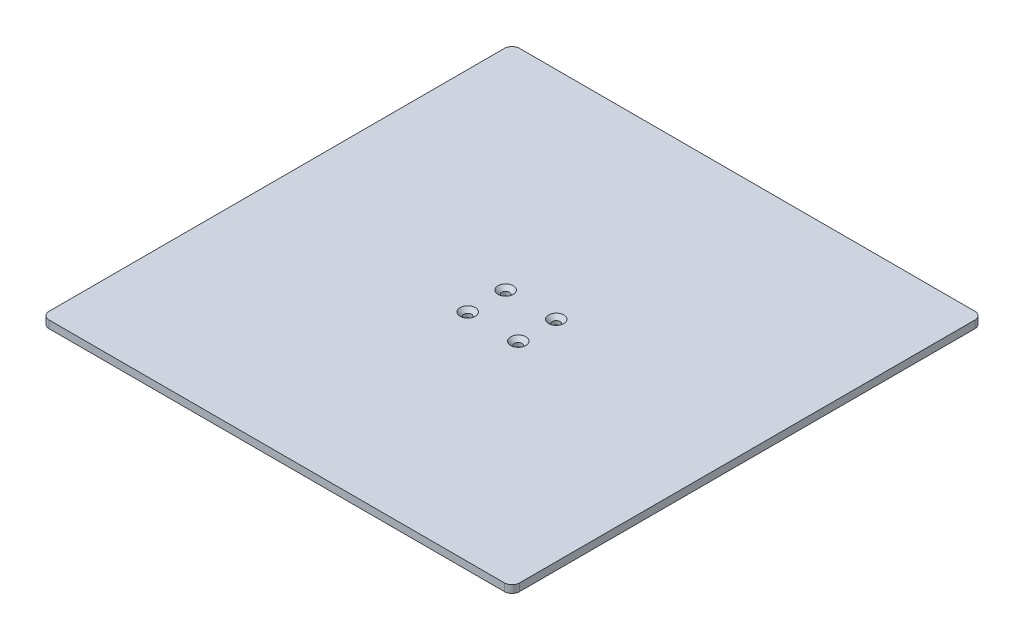
ISO-10303-21;
HEADER;
FILE_DESCRIPTION(('STEP AP214'),'2;1');
FILE_NAME('part.step','',(''),(''),'','','');
FILE_SCHEMA(('AUTOMOTIVE_DESIGN { 1 0 10303 214 1 1 1 1 }'));
ENDSEC;
DATA;
#1=APPLICATION_CONTEXT('core data for automotive mechanical design processes');
#2=APPLICATION_PROTOCOL_DEFINITION('international standard','automotive_design',2000,#1);
#3=PRODUCT_CONTEXT('',#1,'mechanical');
#4=PRODUCT('Part','Part','',(#3));
#5=PRODUCT_RELATED_PRODUCT_CATEGORY('part','',(#4));
#6=PRODUCT_DEFINITION_FORMATION('','',#4);
#7=PRODUCT_DEFINITION_CONTEXT('part definition',#1,'design');
#8=PRODUCT_DEFINITION('design','',#6,#7);
#9=PRODUCT_DEFINITION_SHAPE('','',#8);
#10=(LENGTH_UNIT() NAMED_UNIT(*) SI_UNIT(.MILLI.,.METRE.));
#11=(NAMED_UNIT(*) PLANE_ANGLE_UNIT() SI_UNIT($,.RADIAN.));
#12=(NAMED_UNIT(*) SI_UNIT($,.STERADIAN.) SOLID_ANGLE_UNIT());
#13=UNCERTAINTY_MEASURE_WITH_UNIT(LENGTH_MEASURE(1.E-05),#10,'distance_accuracy_value','');
#14=(GEOMETRIC_REPRESENTATION_CONTEXT(3) GLOBAL_UNCERTAINTY_ASSIGNED_CONTEXT((#13)) GLOBAL_UNIT_ASSIGNED_CONTEXT((#10,
#11,#12)) REPRESENTATION_CONTEXT('',''));
#15=CARTESIAN_POINT('',(0.,0.,0.));
#16=DIRECTION('',(0.,0.,1.));
#17=DIRECTION('',(1.,0.,0.));
#18=AXIS2_PLACEMENT_3D('',#15,#16,#17);
#19=CARTESIAN_POINT('',(93.0000000000001,-3.,93.));
#20=DIRECTION('',(1.,0.,0.));
#21=DIRECTION('',(0.,0.,-1.));
#22=AXIS2_PLACEMENT_3D('',#19,#20,#21);
#23=PLANE('',#22);
#24=DIRECTION('',(0.,0.,-1.));
#25=VECTOR('',#24,1.);
#26=CARTESIAN_POINT('',(93.0000000000001,-3.,93.));
#27=LINE('',#26,#25);
#28=CARTESIAN_POINT('',(93.0000000000001,-3.,90.));
#29=VERTEX_POINT('',#28);
#30=CARTESIAN_POINT('',(93.0000000000001,-3.,-90.));
#31=VERTEX_POINT('',#30);
#32=EDGE_CURVE('E249',#29,#31,#27,.T.);
#33=ORIENTED_EDGE('',*,*,#32,.T.);
#34=DIRECTION('',(0.,1.,0.));
#35=VECTOR('',#34,1.);
#36=CARTESIAN_POINT('',(93.0000000000001,-3.,-90.));
#37=LINE('',#36,#35);
#38=CARTESIAN_POINT('',(93.0000000000001,0.,-90.));
#39=VERTEX_POINT('',#38);
#40=EDGE_CURVE('E150',#31,#39,#37,.T.);
#41=ORIENTED_EDGE('',*,*,#40,.T.);
#42=DIRECTION('',(0.,0.,-1.));
#43=VECTOR('',#42,1.);
#44=CARTESIAN_POINT('',(93.0000000000001,0.,93.));
#45=LINE('',#44,#43);
#46=CARTESIAN_POINT('',(93.0000000000001,0.,90.));
#47=VERTEX_POINT('',#46);
#48=EDGE_CURVE('E248',#47,#39,#45,.T.);
#49=ORIENTED_EDGE('',*,*,#48,.F.);
#50=DIRECTION('',(0.,1.,0.));
#51=VECTOR('',#50,1.);
#52=CARTESIAN_POINT('',(93.0000000000001,-3.,90.));
#53=LINE('',#52,#51);
#54=EDGE_CURVE('E148',#47,#29,#53,.F.);
#55=ORIENTED_EDGE('',*,*,#54,.T.);
#56=EDGE_LOOP('',(#33,#41,#49,#55));
#57=FACE_BOUND('',#56,.T.);
#58=ADVANCED_FACE('F32',(#57),#23,.T.);
#59=CARTESIAN_POINT('',(-93.,-3.,93.));
#60=DIRECTION('',(0.,0.,1.));
#61=DIRECTION('',(1.,0.,0.));
#62=AXIS2_PLACEMENT_3D('',#59,#60,#61);
#63=PLANE('',#62);
#64=DIRECTION('',(1.,0.,0.));
#65=VECTOR('',#64,1.);
#66=CARTESIAN_POINT('',(-93.,0.,93.));
#67=LINE('',#66,#65);
#68=CARTESIAN_POINT('',(-90.,0.,93.));
#69=VERTEX_POINT('',#68);
#70=CARTESIAN_POINT('',(90.0000000000001,0.,93.));
#71=VERTEX_POINT('',#70);
#72=EDGE_CURVE('E118',#69,#71,#67,.T.);
#73=ORIENTED_EDGE('',*,*,#72,.F.);
#74=DIRECTION('',(0.,1.,0.));
#75=VECTOR('',#74,1.);
#76=CARTESIAN_POINT('',(-90.,-3.,93.));
#77=LINE('',#76,#75);
#78=CARTESIAN_POINT('',(-90.,-3.,93.));
#79=VERTEX_POINT('',#78);
#80=EDGE_CURVE('E136',#69,#79,#77,.F.);
#81=ORIENTED_EDGE('',*,*,#80,.T.);
#82=DIRECTION('',(1.,0.,0.));
#83=VECTOR('',#82,1.);
#84=CARTESIAN_POINT('',(-93.,-3.,93.));
#85=LINE('',#84,#83);
#86=CARTESIAN_POINT('',(90.0000000000001,-3.,93.));
#87=VERTEX_POINT('',#86);
#88=EDGE_CURVE('E121',#79,#87,#85,.T.);
#89=ORIENTED_EDGE('',*,*,#88,.T.);
#90=DIRECTION('',(0.,1.,0.));
#91=VECTOR('',#90,1.);
#92=CARTESIAN_POINT('',(90.0000000000001,-3.,93.));
#93=LINE('',#92,#91);
#94=EDGE_CURVE('E133',#87,#71,#93,.T.);
#95=ORIENTED_EDGE('',*,*,#94,.T.);
#96=EDGE_LOOP('',(#73,#81,#89,#95));
#97=FACE_BOUND('',#96,.T.);
#98=ADVANCED_FACE('F190',(#97),#63,.T.);
#99=CARTESIAN_POINT('',(-93.,-3.,93.));
#100=DIRECTION('',(-1.,0.,0.));
#101=DIRECTION('',(0.,0.,1.));
#102=AXIS2_PLACEMENT_3D('',#99,#100,#101);
#103=PLANE('',#102);
#104=DIRECTION('',(0.,0.,1.));
#105=VECTOR('',#104,1.);
#106=CARTESIAN_POINT('',(-93.,-3.,93.));
#107=LINE('',#106,#105);
#108=CARTESIAN_POINT('',(-93.,-3.,-90.));
#109=VERTEX_POINT('',#108);
#110=CARTESIAN_POINT('',(-93.,-3.,90.));
#111=VERTEX_POINT('',#110);
#112=EDGE_CURVE('E126',#109,#111,#107,.T.);
#113=ORIENTED_EDGE('',*,*,#112,.T.);
#114=DIRECTION('',(0.,1.,0.));
#115=VECTOR('',#114,1.);
#116=CARTESIAN_POINT('',(-93.,-3.,90.));
#117=LINE('',#116,#115);
#118=CARTESIAN_POINT('',(-93.,0.,90.));
#119=VERTEX_POINT('',#118);
#120=EDGE_CURVE('E117',#111,#119,#117,.T.);
#121=ORIENTED_EDGE('',*,*,#120,.T.);
#122=DIRECTION('',(0.,0.,1.));
#123=VECTOR('',#122,1.);
#124=CARTESIAN_POINT('',(-93.,0.,93.));
#125=LINE('',#124,#123);
#126=CARTESIAN_POINT('',(-93.,0.,-90.));
#127=VERTEX_POINT('',#126);
#128=EDGE_CURVE('E102',#127,#119,#125,.T.);
#129=ORIENTED_EDGE('',*,*,#128,.F.);
#130=DIRECTION('',(0.,1.,0.));
#131=VECTOR('',#130,1.);
#132=CARTESIAN_POINT('',(-93.,-3.,-90.));
#133=LINE('',#132,#131);
#134=EDGE_CURVE('E115',#127,#109,#133,.F.);
#135=ORIENTED_EDGE('',*,*,#134,.T.);
#136=EDGE_LOOP('',(#113,#121,#129,#135));
#137=FACE_BOUND('',#136,.T.);
#138=ADVANCED_FACE('F114',(#137),#103,.T.);
#139=CARTESIAN_POINT('',(-93.,-3.,-93.));
#140=DIRECTION('',(0.,0.,-1.));
#141=DIRECTION('',(-1.,0.,0.));
#142=AXIS2_PLACEMENT_3D('',#139,#140,#141);
#143=PLANE('',#142);
#144=DIRECTION('',(-1.,0.,0.));
#145=VECTOR('',#144,1.);
#146=CARTESIAN_POINT('',(-93.,-3.,-93.));
#147=LINE('',#146,#145);
#148=CARTESIAN_POINT('',(90.0000000000001,-3.,-93.));
#149=VERTEX_POINT('',#148);
#150=CARTESIAN_POINT('',(-90.,-3.,-93.));
#151=VERTEX_POINT('',#150);
#152=EDGE_CURVE('E251',#149,#151,#147,.T.);
#153=ORIENTED_EDGE('',*,*,#152,.T.);
#154=DIRECTION('',(0.,1.,0.));
#155=VECTOR('',#154,1.);
#156=CARTESIAN_POINT('',(-90.,-3.,-93.));
#157=LINE('',#156,#155);
#158=CARTESIAN_POINT('',(-90.,0.,-93.));
#159=VERTEX_POINT('',#158);
#160=EDGE_CURVE('E146',#151,#159,#157,.T.);
#161=ORIENTED_EDGE('',*,*,#160,.T.);
#162=DIRECTION('',(-1.,0.,0.));
#163=VECTOR('',#162,1.);
#164=CARTESIAN_POINT('',(-93.,0.,-93.));
#165=LINE('',#164,#163);
#166=CARTESIAN_POINT('',(90.0000000000001,0.,-93.));
#167=VERTEX_POINT('',#166);
#168=EDGE_CURVE('E103',#167,#159,#165,.T.);
#169=ORIENTED_EDGE('',*,*,#168,.F.);
#170=DIRECTION('',(0.,1.,0.));
#171=VECTOR('',#170,1.);
#172=CARTESIAN_POINT('',(90.0000000000001,-3.,-93.));
#173=LINE('',#172,#171);
#174=EDGE_CURVE('E54',#167,#149,#173,.F.);
#175=ORIENTED_EDGE('',*,*,#174,.T.);
#176=EDGE_LOOP('',(#153,#161,#169,#175));
#177=FACE_BOUND('',#176,.T.);
#178=ADVANCED_FACE('F201',(#177),#143,.T.);
#179=CARTESIAN_POINT('',(0.,-3.,0.));
#180=DIRECTION('',(0.,-1.,0.));
#181=DIRECTION('',(0.,0.,-1.));
#182=AXIS2_PLACEMENT_3D('',#179,#180,#181);
#183=PLANE('',#182);
#184=CARTESIAN_POINT('',(-10.,-3.,-7.50000000000001));
#185=DIRECTION('',(0.,-1.,0.));
#186=DIRECTION('',(0.,0.,-1.));
#187=AXIS2_PLACEMENT_3D('',#184,#185,#186);
#188=CIRCLE('',#187,1.5);
#189=CARTESIAN_POINT('',(-10.,-3.,-9.00000000000001));
#190=VERTEX_POINT('',#189);
#191=EDGE_CURVE('E240',#190,#190,#188,.T.);
#192=ORIENTED_EDGE('',*,*,#191,.F.);
#193=EDGE_LOOP('',(#192));
#194=FACE_BOUND('',#193,.T.);
#195=CARTESIAN_POINT('',(10.,-3.,-7.50000000000001));
#196=DIRECTION('',(0.,-1.,0.));
#197=DIRECTION('',(0.,0.,-1.));
#198=AXIS2_PLACEMENT_3D('',#195,#196,#197);
#199=CIRCLE('',#198,1.5);
#200=CARTESIAN_POINT('',(10.,-3.,-9.00000000000001));
#201=VERTEX_POINT('',#200);
#202=EDGE_CURVE('E237',#201,#201,#199,.T.);
#203=ORIENTED_EDGE('',*,*,#202,.F.);
#204=EDGE_LOOP('',(#203));
#205=FACE_BOUND('',#204,.T.);
#206=CARTESIAN_POINT('',(10.,-3.,7.49999999999999));
#207=DIRECTION('',(0.,-1.,0.));
#208=DIRECTION('',(0.,0.,-1.));
#209=AXIS2_PLACEMENT_3D('',#206,#207,#208);
#210=CIRCLE('',#209,1.5);
#211=CARTESIAN_POINT('',(10.,-3.,6.));
#212=VERTEX_POINT('',#211);
#213=EDGE_CURVE('E235',#212,#212,#210,.T.);
#214=ORIENTED_EDGE('',*,*,#213,.F.);
#215=EDGE_LOOP('',(#214));
#216=FACE_BOUND('',#215,.T.);
#217=CARTESIAN_POINT('',(-10.,-3.,7.49999999999999));
#218=DIRECTION('',(0.,-1.,0.));
#219=DIRECTION('',(0.,0.,-1.));
#220=AXIS2_PLACEMENT_3D('',#217,#218,#219);
#221=CIRCLE('',#220,1.5);
#222=CARTESIAN_POINT('',(-10.,-3.,5.99999999999999));
#223=VERTEX_POINT('',#222);
#224=EDGE_CURVE('E245',#223,#223,#221,.T.);
#225=ORIENTED_EDGE('',*,*,#224,.F.);
#226=EDGE_LOOP('',(#225));
#227=FACE_BOUND('',#226,.T.);
#228=ORIENTED_EDGE('',*,*,#88,.F.);
#229=CARTESIAN_POINT('',(-90.,-3.,90.));
#230=DIRECTION('',(0.,-1.,0.));
#231=DIRECTION('',(0.,0.,-1.));
#232=AXIS2_PLACEMENT_3D('',#229,#230,#231);
#233=CIRCLE('',#232,3.);
#234=EDGE_CURVE('E143',#79,#111,#233,.T.);
#235=ORIENTED_EDGE('',*,*,#234,.T.);
#236=ORIENTED_EDGE('',*,*,#112,.F.);
#237=CARTESIAN_POINT('',(-90.,-3.,-90.));
#238=DIRECTION('',(0.,-1.,0.));
#239=DIRECTION('',(0.,0.,-1.));
#240=AXIS2_PLACEMENT_3D('',#237,#238,#239);
#241=CIRCLE('',#240,3.);
#242=EDGE_CURVE('E47',#109,#151,#241,.T.);
#243=ORIENTED_EDGE('',*,*,#242,.T.);
#244=ORIENTED_EDGE('',*,*,#152,.F.);
#245=CARTESIAN_POINT('',(90.0000000000001,-3.,-90.));
#246=DIRECTION('',(0.,-1.,0.));
#247=DIRECTION('',(0.,0.,-1.));
#248=AXIS2_PLACEMENT_3D('',#245,#246,#247);
#249=CIRCLE('',#248,3.);
#250=EDGE_CURVE('E140',#149,#31,#249,.T.);
#251=ORIENTED_EDGE('',*,*,#250,.T.);
#252=ORIENTED_EDGE('',*,*,#32,.F.);
#253=CARTESIAN_POINT('',(90.0000000000001,-3.,90.));
#254=DIRECTION('',(0.,-1.,0.));
#255=DIRECTION('',(0.,0.,-1.));
#256=AXIS2_PLACEMENT_3D('',#253,#254,#255);
#257=CIRCLE('',#256,3.);
#258=EDGE_CURVE('E138',#29,#87,#257,.T.);
#259=ORIENTED_EDGE('',*,*,#258,.T.);
#260=EDGE_LOOP('',(#228,#235,#236,#243,#244,#251,#252,#259));
#261=FACE_BOUND('',#260,.T.);
#262=ADVANCED_FACE('F264',(#194,#205,#216,#227,#261),#183,.T.);
#263=CARTESIAN_POINT('',(0.,0.,0.));
#264=DIRECTION('',(0.,-1.,0.));
#265=DIRECTION('',(0.,0.,-1.));
#266=AXIS2_PLACEMENT_3D('',#263,#264,#265);
#267=PLANE('',#266);
#268=CARTESIAN_POINT('',(10.,0.,7.49999999999999));
#269=DIRECTION('',(0.,-1.,0.));
#270=DIRECTION('',(0.,0.,-1.));
#271=AXIS2_PLACEMENT_3D('',#268,#269,#270);
#272=CIRCLE('',#271,3.00000000000003);
#273=CARTESIAN_POINT('',(10.,0.,4.49999999999996));
#274=VERTEX_POINT('',#273);
#275=EDGE_CURVE('E165',#274,#274,#272,.T.);
#276=ORIENTED_EDGE('',*,*,#275,.T.);
#277=EDGE_LOOP('',(#276));
#278=FACE_BOUND('',#277,.T.);
#279=CARTESIAN_POINT('',(-10.,0.,7.49999999999999));
#280=DIRECTION('',(0.,-1.,0.));
#281=DIRECTION('',(0.,0.,-1.));
#282=AXIS2_PLACEMENT_3D('',#279,#280,#281);
#283=CIRCLE('',#282,3.00000000000003);
#284=CARTESIAN_POINT('',(-10.,0.,4.49999999999996));
#285=VERTEX_POINT('',#284);
#286=EDGE_CURVE('E162',#285,#285,#283,.T.);
#287=ORIENTED_EDGE('',*,*,#286,.T.);
#288=EDGE_LOOP('',(#287));
#289=FACE_BOUND('',#288,.T.);
#290=CARTESIAN_POINT('',(-10.,0.,-7.50000000000001));
#291=DIRECTION('',(0.,-1.,0.));
#292=DIRECTION('',(0.,0.,-1.));
#293=AXIS2_PLACEMENT_3D('',#290,#291,#292);
#294=CIRCLE('',#293,3.00000000000003);
#295=CARTESIAN_POINT('',(-10.,0.,-10.5));
#296=VERTEX_POINT('',#295);
#297=EDGE_CURVE('E159',#296,#296,#294,.T.);
#298=ORIENTED_EDGE('',*,*,#297,.T.);
#299=EDGE_LOOP('',(#298));
#300=FACE_BOUND('',#299,.T.);
#301=CARTESIAN_POINT('',(10.,0.,-7.50000000000001));
#302=DIRECTION('',(0.,-1.,0.));
#303=DIRECTION('',(0.,0.,-1.));
#304=AXIS2_PLACEMENT_3D('',#301,#302,#303);
#305=CIRCLE('',#304,3.00000000000003);
#306=CARTESIAN_POINT('',(10.,0.,-10.5));
#307=VERTEX_POINT('',#306);
#308=EDGE_CURVE('E156',#307,#307,#305,.T.);
#309=ORIENTED_EDGE('',*,*,#308,.T.);
#310=EDGE_LOOP('',(#309));
#311=FACE_BOUND('',#310,.T.);
#312=ORIENTED_EDGE('',*,*,#128,.T.);
#313=CARTESIAN_POINT('',(-90.,0.,90.));
#314=DIRECTION('',(0.,-1.,0.));
#315=DIRECTION('',(0.,0.,-1.));
#316=AXIS2_PLACEMENT_3D('',#313,#314,#315);
#317=CIRCLE('',#316,3.);
#318=EDGE_CURVE('E108',#119,#69,#317,.F.);
#319=ORIENTED_EDGE('',*,*,#318,.T.);
#320=ORIENTED_EDGE('',*,*,#72,.T.);
#321=CARTESIAN_POINT('',(90.0000000000001,0.,90.));
#322=DIRECTION('',(0.,-1.,0.));
#323=DIRECTION('',(0.,0.,-1.));
#324=AXIS2_PLACEMENT_3D('',#321,#322,#323);
#325=CIRCLE('',#324,3.);
#326=EDGE_CURVE('E123',#71,#47,#325,.F.);
#327=ORIENTED_EDGE('',*,*,#326,.T.);
#328=ORIENTED_EDGE('',*,*,#48,.T.);
#329=CARTESIAN_POINT('',(90.0000000000001,0.,-90.));
#330=DIRECTION('',(0.,-1.,0.));
#331=DIRECTION('',(0.,0.,-1.));
#332=AXIS2_PLACEMENT_3D('',#329,#330,#331);
#333=CIRCLE('',#332,3.);
#334=EDGE_CURVE('E109',#39,#167,#333,.F.);
#335=ORIENTED_EDGE('',*,*,#334,.T.);
#336=ORIENTED_EDGE('',*,*,#168,.T.);
#337=CARTESIAN_POINT('',(-90.,0.,-90.));
#338=DIRECTION('',(0.,-1.,0.));
#339=DIRECTION('',(0.,0.,-1.));
#340=AXIS2_PLACEMENT_3D('',#337,#338,#339);
#341=CIRCLE('',#340,3.);
#342=EDGE_CURVE('E99',#159,#127,#341,.F.);
#343=ORIENTED_EDGE('',*,*,#342,.T.);
#344=EDGE_LOOP('',(#312,#319,#320,#327,#328,#335,#336,#343));
#345=FACE_BOUND('',#344,.T.);
#346=ADVANCED_FACE('F101',(#278,#289,#300,#311,#345),#267,.F.);
#347=CARTESIAN_POINT('',(-90.,-3.,90.));
#348=DIRECTION('',(0.,1.,0.));
#349=DIRECTION('',(0.,0.,1.));
#350=AXIS2_PLACEMENT_3D('',#347,#348,#349);
#351=CYLINDRICAL_SURFACE('',#350,3.);
#352=ORIENTED_EDGE('',*,*,#234,.F.);
#353=ORIENTED_EDGE('',*,*,#80,.F.);
#354=ORIENTED_EDGE('',*,*,#318,.F.);
#355=ORIENTED_EDGE('',*,*,#120,.F.);
#356=EDGE_LOOP('',(#352,#353,#354,#355));
#357=FACE_BOUND('',#356,.T.);
#358=ADVANCED_FACE('F203',(#357),#351,.T.);
#359=CARTESIAN_POINT('',(-90.,-3.,-90.));
#360=DIRECTION('',(0.,1.,0.));
#361=DIRECTION('',(0.,0.,1.));
#362=AXIS2_PLACEMENT_3D('',#359,#360,#361);
#363=CYLINDRICAL_SURFACE('',#362,3.);
#364=ORIENTED_EDGE('',*,*,#242,.F.);
#365=ORIENTED_EDGE('',*,*,#134,.F.);
#366=ORIENTED_EDGE('',*,*,#342,.F.);
#367=ORIENTED_EDGE('',*,*,#160,.F.);
#368=EDGE_LOOP('',(#364,#365,#366,#367));
#369=FACE_BOUND('',#368,.T.);
#370=ADVANCED_FACE('F120',(#369),#363,.T.);
#371=CARTESIAN_POINT('',(90.0000000000001,-3.,-90.));
#372=DIRECTION('',(0.,1.,0.));
#373=DIRECTION('',(0.,0.,1.));
#374=AXIS2_PLACEMENT_3D('',#371,#372,#373);
#375=CYLINDRICAL_SURFACE('',#374,3.);
#376=ORIENTED_EDGE('',*,*,#250,.F.);
#377=ORIENTED_EDGE('',*,*,#174,.F.);
#378=ORIENTED_EDGE('',*,*,#334,.F.);
#379=ORIENTED_EDGE('',*,*,#40,.F.);
#380=EDGE_LOOP('',(#376,#377,#378,#379));
#381=FACE_BOUND('',#380,.T.);
#382=ADVANCED_FACE('F209',(#381),#375,.T.);
#383=CARTESIAN_POINT('',(90.0000000000001,-3.,90.));
#384=DIRECTION('',(0.,1.,0.));
#385=DIRECTION('',(0.,0.,1.));
#386=AXIS2_PLACEMENT_3D('',#383,#384,#385);
#387=CYLINDRICAL_SURFACE('',#386,3.);
#388=ORIENTED_EDGE('',*,*,#258,.F.);
#389=ORIENTED_EDGE('',*,*,#54,.F.);
#390=ORIENTED_EDGE('',*,*,#326,.F.);
#391=ORIENTED_EDGE('',*,*,#94,.F.);
#392=EDGE_LOOP('',(#388,#389,#390,#391));
#393=FACE_BOUND('',#392,.T.);
#394=ADVANCED_FACE('F212',(#393),#387,.T.);
#395=CARTESIAN_POINT('',(-10.,-10.,7.49999999999999));
#396=DIRECTION('',(0.,1.,0.));
#397=DIRECTION('',(0.,0.,1.));
#398=AXIS2_PLACEMENT_3D('',#395,#396,#397);
#399=CYLINDRICAL_SURFACE('',#398,1.5);
#400=CARTESIAN_POINT('',(-10.,-1.50000000000003,7.49999999999999));
#401=DIRECTION('',(0.,-1.,0.));
#402=DIRECTION('',(0.,0.,-1.));
#403=AXIS2_PLACEMENT_3D('',#400,#401,#402);
#404=CIRCLE('',#403,1.5);
#405=CARTESIAN_POINT('',(-10.,-1.50000000000003,5.99999999999999));
#406=VERTEX_POINT('',#405);
#407=EDGE_CURVE('E168',#406,#406,#404,.F.);
#408=ORIENTED_EDGE('',*,*,#407,.T.);
#409=EDGE_LOOP('',(#408));
#410=FACE_BOUND('',#409,.T.);
#411=ORIENTED_EDGE('',*,*,#224,.T.);
#412=EDGE_LOOP('',(#411));
#413=FACE_BOUND('',#412,.T.);
#414=ADVANCED_FACE('F216',(#410,#413),#399,.F.);
#415=CARTESIAN_POINT('',(10.,-10.,7.49999999999999));
#416=DIRECTION('',(0.,1.,0.));
#417=DIRECTION('',(0.,0.,1.));
#418=AXIS2_PLACEMENT_3D('',#415,#416,#417);
#419=CYLINDRICAL_SURFACE('',#418,1.5);
#420=CARTESIAN_POINT('',(10.,-1.50000000000004,7.49999999999999));
#421=DIRECTION('',(0.,-1.,0.));
#422=DIRECTION('',(0.,0.,-1.));
#423=AXIS2_PLACEMENT_3D('',#420,#421,#422);
#424=CIRCLE('',#423,1.5);
#425=CARTESIAN_POINT('',(10.,-1.50000000000004,6.));
#426=VERTEX_POINT('',#425);
#427=EDGE_CURVE('E153',#426,#426,#424,.F.);
#428=ORIENTED_EDGE('',*,*,#427,.T.);
#429=EDGE_LOOP('',(#428));
#430=FACE_BOUND('',#429,.T.);
#431=ORIENTED_EDGE('',*,*,#213,.T.);
#432=EDGE_LOOP('',(#431));
#433=FACE_BOUND('',#432,.T.);
#434=ADVANCED_FACE('F229',(#430,#433),#419,.F.);
#435=CARTESIAN_POINT('',(10.,-10.,-7.50000000000001));
#436=DIRECTION('',(0.,1.,0.));
#437=DIRECTION('',(0.,0.,1.));
#438=AXIS2_PLACEMENT_3D('',#435,#436,#437);
#439=CYLINDRICAL_SURFACE('',#438,1.5);
#440=CARTESIAN_POINT('',(10.,-1.50000000000004,-7.50000000000001));
#441=DIRECTION('',(0.,-1.,0.));
#442=DIRECTION('',(0.,0.,-1.));
#443=AXIS2_PLACEMENT_3D('',#440,#441,#442);
#444=CIRCLE('',#443,1.5);
#445=CARTESIAN_POINT('',(10.,-1.50000000000004,-9.00000000000001));
#446=VERTEX_POINT('',#445);
#447=EDGE_CURVE('E11',#446,#446,#444,.F.);
#448=ORIENTED_EDGE('',*,*,#447,.T.);
#449=EDGE_LOOP('',(#448));
#450=FACE_BOUND('',#449,.T.);
#451=ORIENTED_EDGE('',*,*,#202,.T.);
#452=EDGE_LOOP('',(#451));
#453=FACE_BOUND('',#452,.T.);
#454=ADVANCED_FACE('F223',(#450,#453),#439,.F.);
#455=CARTESIAN_POINT('',(-10.,-10.,-7.50000000000001));
#456=DIRECTION('',(0.,1.,0.));
#457=DIRECTION('',(0.,0.,1.));
#458=AXIS2_PLACEMENT_3D('',#455,#456,#457);
#459=CYLINDRICAL_SURFACE('',#458,1.5);
#460=CARTESIAN_POINT('',(-10.,-1.50000000000004,-7.50000000000001));
#461=DIRECTION('',(0.,-1.,0.));
#462=DIRECTION('',(0.,0.,-1.));
#463=AXIS2_PLACEMENT_3D('',#460,#461,#462);
#464=CIRCLE('',#463,1.5);
#465=CARTESIAN_POINT('',(-10.,-1.50000000000004,-9.00000000000001));
#466=VERTEX_POINT('',#465);
#467=EDGE_CURVE('E40',#466,#466,#464,.F.);
#468=ORIENTED_EDGE('',*,*,#467,.T.);
#469=EDGE_LOOP('',(#468));
#470=FACE_BOUND('',#469,.T.);
#471=ORIENTED_EDGE('',*,*,#191,.T.);
#472=EDGE_LOOP('',(#471));
#473=FACE_BOUND('',#472,.T.);
#474=ADVANCED_FACE('F173',(#470,#473),#459,.F.);
#475=CARTESIAN_POINT('',(10.,-1.50000000000004,7.49999999999999));
#476=DIRECTION('',(0.,1.,0.));
#477=DIRECTION('',(0.,0.,1.));
#478=AXIS2_PLACEMENT_3D('',#475,#476,#477);
#479=CONICAL_SURFACE('',#478,1.5,0.785398163397446);
#480=ORIENTED_EDGE('',*,*,#275,.F.);
#481=EDGE_LOOP('',(#480));
#482=FACE_BOUND('',#481,.T.);
#483=ORIENTED_EDGE('',*,*,#427,.F.);
#484=EDGE_LOOP('',(#483));
#485=FACE_BOUND('',#484,.T.);
#486=ADVANCED_FACE('F185',(#482,#485),#479,.F.);
#487=CARTESIAN_POINT('',(-10.,-1.50000000000003,7.49999999999999));
#488=DIRECTION('',(0.,1.,0.));
#489=DIRECTION('',(0.,0.,1.));
#490=AXIS2_PLACEMENT_3D('',#487,#488,#489);
#491=CONICAL_SURFACE('',#490,1.5,0.785398163397447);
#492=ORIENTED_EDGE('',*,*,#286,.F.);
#493=EDGE_LOOP('',(#492));
#494=FACE_BOUND('',#493,.T.);
#495=ORIENTED_EDGE('',*,*,#407,.F.);
#496=EDGE_LOOP('',(#495));
#497=FACE_BOUND('',#496,.T.);
#498=ADVANCED_FACE('F178',(#494,#497),#491,.F.);
#499=CARTESIAN_POINT('',(-10.,-1.50000000000004,-7.50000000000001));
#500=DIRECTION('',(0.,1.,0.));
#501=DIRECTION('',(0.,0.,1.));
#502=AXIS2_PLACEMENT_3D('',#499,#500,#501);
#503=CONICAL_SURFACE('',#502,1.5,0.785398163397447);
#504=ORIENTED_EDGE('',*,*,#297,.F.);
#505=EDGE_LOOP('',(#504));
#506=FACE_BOUND('',#505,.T.);
#507=ORIENTED_EDGE('',*,*,#467,.F.);
#508=EDGE_LOOP('',(#507));
#509=FACE_BOUND('',#508,.T.);
#510=ADVANCED_FACE('F176',(#506,#509),#503,.F.);
#511=CARTESIAN_POINT('',(10.,-1.50000000000004,-7.50000000000001));
#512=DIRECTION('',(0.,1.,0.));
#513=DIRECTION('',(0.,0.,1.));
#514=AXIS2_PLACEMENT_3D('',#511,#512,#513);
#515=CONICAL_SURFACE('',#514,1.5,0.785398163397446);
#516=ORIENTED_EDGE('',*,*,#308,.F.);
#517=EDGE_LOOP('',(#516));
#518=FACE_BOUND('',#517,.T.);
#519=ORIENTED_EDGE('',*,*,#447,.F.);
#520=EDGE_LOOP('',(#519));
#521=FACE_BOUND('',#520,.T.);
#522=ADVANCED_FACE('F34',(#518,#521),#515,.F.);
#523=CLOSED_SHELL('',(#58,#98,#138,#178,#262,#346,#358,#370,#382,#394,#414,#434,#454,#474,#486,
#498,#510,#522));
#524=MANIFOLD_SOLID_BREP('B2',#523);
#525=ADVANCED_BREP_SHAPE_REPRESENTATION('',(#18,#524),#14);
#526=SHAPE_DEFINITION_REPRESENTATION(#9,#525);
ENDSEC;
END-ISO-10303-21;
